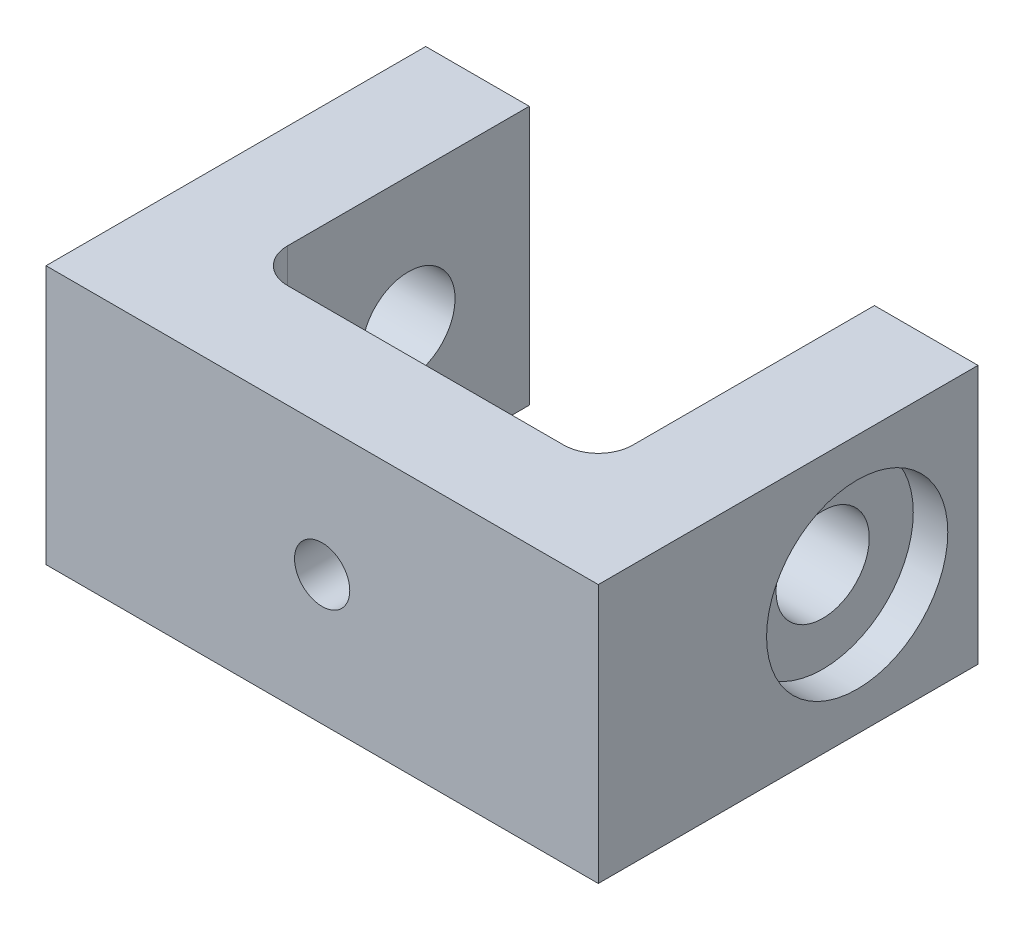
ISO-10303-21;
HEADER;
FILE_DESCRIPTION(('STEP AP214'),'2;1');
FILE_NAME('part.step','',(''),(''),'','','');
FILE_SCHEMA(('AUTOMOTIVE_DESIGN { 1 0 10303 214 1 1 1 1 }'));
ENDSEC;
DATA;
#1=APPLICATION_CONTEXT('core data for automotive mechanical design processes');
#2=APPLICATION_PROTOCOL_DEFINITION('international standard','automotive_design',2000,#1);
#3=PRODUCT_CONTEXT('',#1,'mechanical');
#4=PRODUCT('Part','Part','',(#3));
#5=PRODUCT_RELATED_PRODUCT_CATEGORY('part','',(#4));
#6=PRODUCT_DEFINITION_FORMATION('','',#4);
#7=PRODUCT_DEFINITION_CONTEXT('part definition',#1,'design');
#8=PRODUCT_DEFINITION('design','',#6,#7);
#9=PRODUCT_DEFINITION_SHAPE('','',#8);
#10=(LENGTH_UNIT() NAMED_UNIT(*) SI_UNIT(.MILLI.,.METRE.));
#11=(NAMED_UNIT(*) PLANE_ANGLE_UNIT() SI_UNIT($,.RADIAN.));
#12=(NAMED_UNIT(*) SI_UNIT($,.STERADIAN.) SOLID_ANGLE_UNIT());
#13=UNCERTAINTY_MEASURE_WITH_UNIT(LENGTH_MEASURE(1.E-05),#10,'distance_accuracy_value','');
#14=(GEOMETRIC_REPRESENTATION_CONTEXT(3) GLOBAL_UNCERTAINTY_ASSIGNED_CONTEXT((#13)) GLOBAL_UNIT_ASSIGNED_CONTEXT((#10,
#11,#12)) REPRESENTATION_CONTEXT('',''));
#15=CARTESIAN_POINT('',(0.,0.,0.));
#16=DIRECTION('',(0.,0.,1.));
#17=DIRECTION('',(1.,0.,0.));
#18=AXIS2_PLACEMENT_3D('',#15,#16,#17);
#19=CARTESIAN_POINT('',(0.,-7.5,0.));
#20=DIRECTION('',(0.,1.,0.));
#21=DIRECTION('',(1.,0.,0.));
#22=AXIS2_PLACEMENT_3D('',#19,#20,#21);
#23=PLANE('',#22);
#24=CARTESIAN_POINT('',(8.,-7.5,-8.));
#25=DIRECTION('',(0.,1.,0.));
#26=DIRECTION('',(0.,0.,1.));
#27=AXIS2_PLACEMENT_3D('',#24,#25,#26);
#28=CIRCLE('',#27,2.);
#29=CARTESIAN_POINT('',(8.,-7.5,-6.));
#30=VERTEX_POINT('',#29);
#31=CARTESIAN_POINT('',(10.,-7.5,-8.));
#32=VERTEX_POINT('',#31);
#33=EDGE_CURVE('E11',#30,#32,#28,.T.);
#34=ORIENTED_EDGE('',*,*,#33,.T.);
#35=DIRECTION('',(0.,0.,1.));
#36=VECTOR('',#35,1.);
#37=CARTESIAN_POINT('',(10.,-7.5,-22.));
#38=LINE('',#37,#36);
#39=CARTESIAN_POINT('',(10.,-7.5,-22.));
#40=VERTEX_POINT('',#39);
#41=EDGE_CURVE('E36',#40,#32,#38,.T.);
#42=ORIENTED_EDGE('',*,*,#41,.F.);
#43=DIRECTION('',(-1.,0.,0.));
#44=VECTOR('',#43,1.);
#45=CARTESIAN_POINT('',(16.,-7.5,-22.));
#46=LINE('',#45,#44);
#47=CARTESIAN_POINT('',(16.,-7.5,-22.));
#48=VERTEX_POINT('',#47);
#49=EDGE_CURVE('E136',#48,#40,#46,.T.);
#50=ORIENTED_EDGE('',*,*,#49,.F.);
#51=DIRECTION('',(0.,0.,-1.));
#52=VECTOR('',#51,1.);
#53=CARTESIAN_POINT('',(16.,-7.5,0.));
#54=LINE('',#53,#52);
#55=CARTESIAN_POINT('',(16.,-7.5,0.));
#56=VERTEX_POINT('',#55);
#57=EDGE_CURVE('E114',#56,#48,#54,.T.);
#58=ORIENTED_EDGE('',*,*,#57,.F.);
#59=DIRECTION('',(1.,0.,0.));
#60=VECTOR('',#59,1.);
#61=CARTESIAN_POINT('',(-16.,-7.5,0.));
#62=LINE('',#61,#60);
#63=CARTESIAN_POINT('',(-16.,-7.5,0.));
#64=VERTEX_POINT('',#63);
#65=EDGE_CURVE('E112',#64,#56,#62,.T.);
#66=ORIENTED_EDGE('',*,*,#65,.F.);
#67=DIRECTION('',(0.,0.,1.));
#68=VECTOR('',#67,1.);
#69=CARTESIAN_POINT('',(-16.,-7.5,-22.));
#70=LINE('',#69,#68);
#71=CARTESIAN_POINT('',(-16.,-7.5,-22.));
#72=VERTEX_POINT('',#71);
#73=EDGE_CURVE('E398',#72,#64,#70,.T.);
#74=ORIENTED_EDGE('',*,*,#73,.F.);
#75=DIRECTION('',(-1.,0.,0.));
#76=VECTOR('',#75,1.);
#77=CARTESIAN_POINT('',(-10.,-7.5,-22.));
#78=LINE('',#77,#76);
#79=CARTESIAN_POINT('',(-10.,-7.5,-22.));
#80=VERTEX_POINT('',#79);
#81=EDGE_CURVE('E403',#80,#72,#78,.T.);
#82=ORIENTED_EDGE('',*,*,#81,.F.);
#83=DIRECTION('',(0.,0.,-1.));
#84=VECTOR('',#83,1.);
#85=CARTESIAN_POINT('',(-10.,-7.5,-8.));
#86=LINE('',#85,#84);
#87=CARTESIAN_POINT('',(-10.,-7.5,-8.));
#88=VERTEX_POINT('',#87);
#89=EDGE_CURVE('E408',#88,#80,#86,.T.);
#90=ORIENTED_EDGE('',*,*,#89,.F.);
#91=CARTESIAN_POINT('',(-8.,-7.5,-8.));
#92=DIRECTION('',(0.,1.,0.));
#93=DIRECTION('',(-1.,0.,0.));
#94=AXIS2_PLACEMENT_3D('',#91,#92,#93);
#95=CIRCLE('',#94,2.);
#96=CARTESIAN_POINT('',(-8.,-7.5,-6.));
#97=VERTEX_POINT('',#96);
#98=EDGE_CURVE('E27',#88,#97,#95,.T.);
#99=ORIENTED_EDGE('',*,*,#98,.T.);
#100=DIRECTION('',(-1.,0.,0.));
#101=VECTOR('',#100,1.);
#102=CARTESIAN_POINT('',(8.,-7.5,-6.));
#103=LINE('',#102,#101);
#104=EDGE_CURVE('E429',#30,#97,#103,.T.);
#105=ORIENTED_EDGE('',*,*,#104,.F.);
#106=EDGE_LOOP('',(#34,#42,#50,#58,#66,#74,#82,#90,#99,#105));
#107=FACE_BOUND('',#106,.T.);
#108=ADVANCED_FACE('F17',(#107),#23,.F.);
#109=CARTESIAN_POINT('',(10.,-7.5,-6.));
#110=DIRECTION('',(0.,0.,-1.));
#111=DIRECTION('',(-1.,0.,0.));
#112=AXIS2_PLACEMENT_3D('',#109,#110,#111);
#113=PLANE('',#112);
#114=ORIENTED_EDGE('',*,*,#104,.T.);
#115=DIRECTION('',(0.,1.,0.));
#116=VECTOR('',#115,1.);
#117=CARTESIAN_POINT('',(-8.,-7.5,-6.));
#118=LINE('',#117,#116);
#119=CARTESIAN_POINT('',(-8.,7.5,-6.));
#120=VERTEX_POINT('',#119);
#121=EDGE_CURVE('E431',#97,#120,#118,.T.);
#122=ORIENTED_EDGE('',*,*,#121,.T.);
#123=DIRECTION('',(-1.,0.,0.));
#124=VECTOR('',#123,1.);
#125=CARTESIAN_POINT('',(8.,7.5,-6.));
#126=LINE('',#125,#124);
#127=CARTESIAN_POINT('',(8.,7.5,-6.));
#128=VERTEX_POINT('',#127);
#129=EDGE_CURVE('E132',#128,#120,#126,.T.);
#130=ORIENTED_EDGE('',*,*,#129,.F.);
#131=DIRECTION('',(0.,1.,0.));
#132=VECTOR('',#131,1.);
#133=CARTESIAN_POINT('',(8.,-7.5,-6.));
#134=LINE('',#133,#132);
#135=EDGE_CURVE('E436',#30,#128,#134,.T.);
#136=ORIENTED_EDGE('',*,*,#135,.F.);
#137=EDGE_LOOP('',(#114,#122,#130,#136));
#138=FACE_BOUND('',#137,.T.);
#139=CARTESIAN_POINT('',(0.,0.,-6.));
#140=DIRECTION('',(0.,0.,1.));
#141=DIRECTION('',(1.,0.,0.));
#142=AXIS2_PLACEMENT_3D('',#139,#140,#141);
#143=CIRCLE('',#142,5.75);
#144=CARTESIAN_POINT('',(5.75,0.,-6.));
#145=VERTEX_POINT('',#144);
#146=EDGE_CURVE('E434',#145,#145,#143,.T.);
#147=ORIENTED_EDGE('',*,*,#146,.T.);
#148=EDGE_LOOP('',(#147));
#149=FACE_BOUND('',#148,.T.);
#150=ADVANCED_FACE('F158',(#138,#149),#113,.T.);
#151=CARTESIAN_POINT('',(8.,-27.054,-8.));
#152=DIRECTION('',(0.,1.,0.));
#153=DIRECTION('',(0.,0.,1.));
#154=AXIS2_PLACEMENT_3D('',#151,#152,#153);
#155=CYLINDRICAL_SURFACE('',#154,2.);
#156=CARTESIAN_POINT('',(8.,7.5,-8.));
#157=DIRECTION('',(0.,-1.,0.));
#158=DIRECTION('',(1.,0.,0.));
#159=AXIS2_PLACEMENT_3D('',#156,#157,#158);
#160=CIRCLE('',#159,2.);
#161=CARTESIAN_POINT('',(10.,7.5,-8.));
#162=VERTEX_POINT('',#161);
#163=EDGE_CURVE('E374',#162,#128,#160,.T.);
#164=ORIENTED_EDGE('',*,*,#163,.F.);
#165=DIRECTION('',(0.,1.,0.));
#166=VECTOR('',#165,1.);
#167=CARTESIAN_POINT('',(10.,-7.5,-8.));
#168=LINE('',#167,#166);
#169=EDGE_CURVE('E372',#32,#162,#168,.T.);
#170=ORIENTED_EDGE('',*,*,#169,.F.);
#171=ORIENTED_EDGE('',*,*,#33,.F.);
#172=ORIENTED_EDGE('',*,*,#135,.T.);
#173=EDGE_LOOP('',(#164,#170,#171,#172));
#174=FACE_BOUND('',#173,.T.);
#175=ADVANCED_FACE('F164',(#174),#155,.F.);
#176=CARTESIAN_POINT('',(10.,-7.5,-22.));
#177=DIRECTION('',(-1.,0.,0.));
#178=DIRECTION('',(0.,0.,1.));
#179=AXIS2_PLACEMENT_3D('',#176,#177,#178);
#180=PLANE('',#179);
#181=DIRECTION('',(0.,0.,1.));
#182=VECTOR('',#181,1.);
#183=CARTESIAN_POINT('',(10.,7.5,-22.));
#184=LINE('',#183,#182);
#185=CARTESIAN_POINT('',(10.,7.5,-22.));
#186=VERTEX_POINT('',#185);
#187=EDGE_CURVE('E128',#186,#162,#184,.T.);
#188=ORIENTED_EDGE('',*,*,#187,.F.);
#189=DIRECTION('',(0.,1.,0.));
#190=VECTOR('',#189,1.);
#191=CARTESIAN_POINT('',(10.,-7.5,-22.));
#192=LINE('',#191,#190);
#193=EDGE_CURVE('E365',#40,#186,#192,.T.);
#194=ORIENTED_EDGE('',*,*,#193,.F.);
#195=ORIENTED_EDGE('',*,*,#41,.T.);
#196=ORIENTED_EDGE('',*,*,#169,.T.);
#197=EDGE_LOOP('',(#188,#194,#195,#196));
#198=FACE_BOUND('',#197,.T.);
#199=CARTESIAN_POINT('',(10.,0.,-15.));
#200=DIRECTION('',(1.,0.,0.));
#201=DIRECTION('',(0.,-1.,0.));
#202=AXIS2_PLACEMENT_3D('',#199,#200,#201);
#203=CIRCLE('',#202,2.7);
#204=CARTESIAN_POINT('',(10.,-2.7,-15.));
#205=VERTEX_POINT('',#204);
#206=EDGE_CURVE('E379',#205,#205,#203,.T.);
#207=ORIENTED_EDGE('',*,*,#206,.T.);
#208=EDGE_LOOP('',(#207));
#209=FACE_BOUND('',#208,.T.);
#210=ADVANCED_FACE('F170',(#198,#209),#180,.T.);
#211=CARTESIAN_POINT('',(-16.,0.,-15.));
#212=DIRECTION('',(1.,0.,0.));
#213=DIRECTION('',(0.,1.,0.));
#214=AXIS2_PLACEMENT_3D('',#211,#212,#213);
#215=CYLINDRICAL_SURFACE('',#214,2.7);
#216=CARTESIAN_POINT('',(-10.,0.,-15.));
#217=DIRECTION('',(1.,0.,0.));
#218=DIRECTION('',(0.,1.,0.));
#219=AXIS2_PLACEMENT_3D('',#216,#217,#218);
#220=CIRCLE('',#219,2.7);
#221=CARTESIAN_POINT('',(-10.,2.7,-15.));
#222=VERTEX_POINT('',#221);
#223=EDGE_CURVE('E382',#222,#222,#220,.T.);
#224=ORIENTED_EDGE('',*,*,#223,.T.);
#225=EDGE_LOOP('',(#224));
#226=FACE_BOUND('',#225,.T.);
#227=CARTESIAN_POINT('',(-14.,0.,-15.));
#228=DIRECTION('',(1.,0.,0.));
#229=DIRECTION('',(0.,1.,0.));
#230=AXIS2_PLACEMENT_3D('',#227,#228,#229);
#231=CIRCLE('',#230,2.7);
#232=CARTESIAN_POINT('',(-14.,2.7,-15.));
#233=VERTEX_POINT('',#232);
#234=EDGE_CURVE('E386',#233,#233,#231,.T.);
#235=ORIENTED_EDGE('',*,*,#234,.F.);
#236=EDGE_LOOP('',(#235));
#237=FACE_BOUND('',#236,.T.);
#238=ADVANCED_FACE('F174',(#226,#237),#215,.F.);
#239=CARTESIAN_POINT('',(-16.,0.,-15.));
#240=DIRECTION('',(1.,0.,0.));
#241=DIRECTION('',(0.,1.,0.));
#242=AXIS2_PLACEMENT_3D('',#239,#240,#241);
#243=CYLINDRICAL_SURFACE('',#242,2.7);
#244=CARTESIAN_POINT('',(14.,0.,-15.));
#245=DIRECTION('',(1.,0.,0.));
#246=DIRECTION('',(0.,1.,0.));
#247=AXIS2_PLACEMENT_3D('',#244,#245,#246);
#248=CIRCLE('',#247,2.7);
#249=CARTESIAN_POINT('',(14.,2.7,-15.));
#250=VERTEX_POINT('',#249);
#251=EDGE_CURVE('E385',#250,#250,#248,.T.);
#252=ORIENTED_EDGE('',*,*,#251,.T.);
#253=EDGE_LOOP('',(#252));
#254=FACE_BOUND('',#253,.T.);
#255=ORIENTED_EDGE('',*,*,#206,.F.);
#256=EDGE_LOOP('',(#255));
#257=FACE_BOUND('',#256,.T.);
#258=ADVANCED_FACE('F177',(#254,#257),#243,.F.);
#259=CARTESIAN_POINT('',(-14.,-7.5,0.));
#260=DIRECTION('',(-1.,0.,0.));
#261=DIRECTION('',(0.,1.,0.));
#262=AXIS2_PLACEMENT_3D('',#259,#260,#261);
#263=PLANE('',#262);
#264=CARTESIAN_POINT('',(-14.,0.,-15.));
#265=DIRECTION('',(-1.,0.,0.));
#266=DIRECTION('',(0.,-1.,0.));
#267=AXIS2_PLACEMENT_3D('',#264,#265,#266);
#268=CIRCLE('',#267,5.25);
#269=CARTESIAN_POINT('',(-14.,-5.25,-15.));
#270=VERTEX_POINT('',#269);
#271=EDGE_CURVE('E389',#270,#270,#268,.T.);
#272=ORIENTED_EDGE('',*,*,#271,.T.);
#273=EDGE_LOOP('',(#272));
#274=FACE_BOUND('',#273,.T.);
#275=ORIENTED_EDGE('',*,*,#234,.T.);
#276=EDGE_LOOP('',(#275));
#277=FACE_BOUND('',#276,.T.);
#278=ADVANCED_FACE('F181',(#274,#277),#263,.T.);
#279=CARTESIAN_POINT('',(-16.,0.,-15.));
#280=DIRECTION('',(-1.,0.,0.));
#281=DIRECTION('',(0.,1.,0.));
#282=AXIS2_PLACEMENT_3D('',#279,#280,#281);
#283=CYLINDRICAL_SURFACE('',#282,5.25);
#284=ORIENTED_EDGE('',*,*,#271,.F.);
#285=EDGE_LOOP('',(#284));
#286=FACE_BOUND('',#285,.T.);
#287=CARTESIAN_POINT('',(-16.,0.,-15.));
#288=DIRECTION('',(-1.,0.,0.));
#289=DIRECTION('',(0.,1.,0.));
#290=AXIS2_PLACEMENT_3D('',#287,#288,#289);
#291=CIRCLE('',#290,5.25);
#292=CARTESIAN_POINT('',(-16.,5.25,-15.));
#293=VERTEX_POINT('',#292);
#294=EDGE_CURVE('E390',#293,#293,#291,.T.);
#295=ORIENTED_EDGE('',*,*,#294,.T.);
#296=EDGE_LOOP('',(#295));
#297=FACE_BOUND('',#296,.T.);
#298=ADVANCED_FACE('F185',(#286,#297),#283,.F.);
#299=CARTESIAN_POINT('',(-16.,-7.5,-22.));
#300=DIRECTION('',(-1.,0.,0.));
#301=DIRECTION('',(0.,0.,1.));
#302=AXIS2_PLACEMENT_3D('',#299,#300,#301);
#303=PLANE('',#302);
#304=DIRECTION('',(0.,1.,0.));
#305=VECTOR('',#304,1.);
#306=CARTESIAN_POINT('',(-16.,-7.5,0.));
#307=LINE('',#306,#305);
#308=CARTESIAN_POINT('',(-16.,7.5,0.));
#309=VERTEX_POINT('',#308);
#310=EDGE_CURVE('E397',#64,#309,#307,.T.);
#311=ORIENTED_EDGE('',*,*,#310,.T.);
#312=DIRECTION('',(0.,0.,1.));
#313=VECTOR('',#312,1.);
#314=CARTESIAN_POINT('',(-16.,7.5,-22.));
#315=LINE('',#314,#313);
#316=CARTESIAN_POINT('',(-16.,7.5,-22.));
#317=VERTEX_POINT('',#316);
#318=EDGE_CURVE('E118',#317,#309,#315,.T.);
#319=ORIENTED_EDGE('',*,*,#318,.F.);
#320=DIRECTION('',(0.,1.,0.));
#321=VECTOR('',#320,1.);
#322=CARTESIAN_POINT('',(-16.,-7.5,-22.));
#323=LINE('',#322,#321);
#324=EDGE_CURVE('E400',#72,#317,#323,.T.);
#325=ORIENTED_EDGE('',*,*,#324,.F.);
#326=ORIENTED_EDGE('',*,*,#73,.T.);
#327=EDGE_LOOP('',(#311,#319,#325,#326));
#328=FACE_BOUND('',#327,.T.);
#329=ORIENTED_EDGE('',*,*,#294,.F.);
#330=EDGE_LOOP('',(#329));
#331=FACE_BOUND('',#330,.T.);
#332=ADVANCED_FACE('F189',(#328,#331),#303,.T.);
#333=CARTESIAN_POINT('',(-10.,-7.5,-22.));
#334=DIRECTION('',(0.,0.,-1.));
#335=DIRECTION('',(-1.,0.,0.));
#336=AXIS2_PLACEMENT_3D('',#333,#334,#335);
#337=PLANE('',#336);
#338=ORIENTED_EDGE('',*,*,#324,.T.);
#339=DIRECTION('',(-1.,0.,0.));
#340=VECTOR('',#339,1.);
#341=CARTESIAN_POINT('',(-10.,7.5,-22.));
#342=LINE('',#341,#340);
#343=CARTESIAN_POINT('',(-10.,7.5,-22.));
#344=VERTEX_POINT('',#343);
#345=EDGE_CURVE('E121',#344,#317,#342,.T.);
#346=ORIENTED_EDGE('',*,*,#345,.F.);
#347=DIRECTION('',(0.,1.,0.));
#348=VECTOR('',#347,1.);
#349=CARTESIAN_POINT('',(-10.,-7.5,-22.));
#350=LINE('',#349,#348);
#351=EDGE_CURVE('E405',#80,#344,#350,.T.);
#352=ORIENTED_EDGE('',*,*,#351,.F.);
#353=ORIENTED_EDGE('',*,*,#81,.T.);
#354=EDGE_LOOP('',(#338,#346,#352,#353));
#355=FACE_BOUND('',#354,.T.);
#356=ADVANCED_FACE('F193',(#355),#337,.T.);
#357=CARTESIAN_POINT('',(-10.,-7.5,-6.));
#358=DIRECTION('',(1.,0.,0.));
#359=DIRECTION('',(0.,0.,-1.));
#360=AXIS2_PLACEMENT_3D('',#357,#358,#359);
#361=PLANE('',#360);
#362=ORIENTED_EDGE('',*,*,#89,.T.);
#363=ORIENTED_EDGE('',*,*,#351,.T.);
#364=DIRECTION('',(0.,0.,-1.));
#365=VECTOR('',#364,1.);
#366=CARTESIAN_POINT('',(-10.,7.5,-8.));
#367=LINE('',#366,#365);
#368=CARTESIAN_POINT('',(-10.,7.5,-8.));
#369=VERTEX_POINT('',#368);
#370=EDGE_CURVE('E133',#369,#344,#367,.T.);
#371=ORIENTED_EDGE('',*,*,#370,.F.);
#372=DIRECTION('',(0.,1.,0.));
#373=VECTOR('',#372,1.);
#374=CARTESIAN_POINT('',(-10.,-7.5,-8.));
#375=LINE('',#374,#373);
#376=EDGE_CURVE('E367',#88,#369,#375,.T.);
#377=ORIENTED_EDGE('',*,*,#376,.F.);
#378=EDGE_LOOP('',(#362,#363,#371,#377));
#379=FACE_BOUND('',#378,.T.);
#380=ORIENTED_EDGE('',*,*,#223,.F.);
#381=EDGE_LOOP('',(#380));
#382=FACE_BOUND('',#381,.T.);
#383=ADVANCED_FACE('F197',(#379,#382),#361,.T.);
#384=CARTESIAN_POINT('',(14.,-7.5,0.));
#385=DIRECTION('',(1.,0.,0.));
#386=DIRECTION('',(0.,-1.,0.));
#387=AXIS2_PLACEMENT_3D('',#384,#385,#386);
#388=PLANE('',#387);
#389=CARTESIAN_POINT('',(14.,0.,-15.));
#390=DIRECTION('',(1.,0.,0.));
#391=DIRECTION('',(0.,1.,0.));
#392=AXIS2_PLACEMENT_3D('',#389,#390,#391);
#393=CIRCLE('',#392,5.25);
#394=CARTESIAN_POINT('',(14.,5.25,-15.));
#395=VERTEX_POINT('',#394);
#396=EDGE_CURVE('E409',#395,#395,#393,.T.);
#397=ORIENTED_EDGE('',*,*,#396,.T.);
#398=EDGE_LOOP('',(#397));
#399=FACE_BOUND('',#398,.T.);
#400=ORIENTED_EDGE('',*,*,#251,.F.);
#401=EDGE_LOOP('',(#400));
#402=FACE_BOUND('',#401,.T.);
#403=ADVANCED_FACE('F201',(#399,#402),#388,.T.);
#404=CARTESIAN_POINT('',(16.,0.,-15.));
#405=DIRECTION('',(1.,0.,0.));
#406=DIRECTION('',(0.,-1.,0.));
#407=AXIS2_PLACEMENT_3D('',#404,#405,#406);
#408=CYLINDRICAL_SURFACE('',#407,5.25);
#409=ORIENTED_EDGE('',*,*,#396,.F.);
#410=EDGE_LOOP('',(#409));
#411=FACE_BOUND('',#410,.T.);
#412=CARTESIAN_POINT('',(16.,0.,-15.));
#413=DIRECTION('',(1.,0.,0.));
#414=DIRECTION('',(0.,-1.,0.));
#415=AXIS2_PLACEMENT_3D('',#412,#413,#414);
#416=CIRCLE('',#415,5.25);
#417=CARTESIAN_POINT('',(16.,-5.25,-15.));
#418=VERTEX_POINT('',#417);
#419=EDGE_CURVE('E415',#418,#418,#416,.T.);
#420=ORIENTED_EDGE('',*,*,#419,.T.);
#421=EDGE_LOOP('',(#420));
#422=FACE_BOUND('',#421,.T.);
#423=ADVANCED_FACE('F205',(#411,#422),#408,.F.);
#424=CARTESIAN_POINT('',(16.,-7.5,0.));
#425=DIRECTION('',(1.,0.,0.));
#426=DIRECTION('',(0.,0.,-1.));
#427=AXIS2_PLACEMENT_3D('',#424,#425,#426);
#428=PLANE('',#427);
#429=DIRECTION('',(0.,1.,0.));
#430=VECTOR('',#429,1.);
#431=CARTESIAN_POINT('',(16.,-7.5,-22.));
#432=LINE('',#431,#430);
#433=CARTESIAN_POINT('',(16.,7.5,-22.));
#434=VERTEX_POINT('',#433);
#435=EDGE_CURVE('E102',#48,#434,#432,.T.);
#436=ORIENTED_EDGE('',*,*,#435,.T.);
#437=DIRECTION('',(0.,0.,-1.));
#438=VECTOR('',#437,1.);
#439=CARTESIAN_POINT('',(16.,7.5,0.));
#440=LINE('',#439,#438);
#441=CARTESIAN_POINT('',(16.,7.5,0.));
#442=VERTEX_POINT('',#441);
#443=EDGE_CURVE('E92',#442,#434,#440,.T.);
#444=ORIENTED_EDGE('',*,*,#443,.F.);
#445=DIRECTION('',(0.,1.,0.));
#446=VECTOR('',#445,1.);
#447=CARTESIAN_POINT('',(16.,-7.5,0.));
#448=LINE('',#447,#446);
#449=EDGE_CURVE('E100',#56,#442,#448,.T.);
#450=ORIENTED_EDGE('',*,*,#449,.F.);
#451=ORIENTED_EDGE('',*,*,#57,.T.);
#452=EDGE_LOOP('',(#436,#444,#450,#451));
#453=FACE_BOUND('',#452,.T.);
#454=ORIENTED_EDGE('',*,*,#419,.F.);
#455=EDGE_LOOP('',(#454));
#456=FACE_BOUND('',#455,.T.);
#457=ADVANCED_FACE('F97',(#453,#456),#428,.T.);
#458=CARTESIAN_POINT('',(-16.,-7.5,0.));
#459=DIRECTION('',(0.,0.,1.));
#460=DIRECTION('',(1.,0.,0.));
#461=AXIS2_PLACEMENT_3D('',#458,#459,#460);
#462=PLANE('',#461);
#463=ORIENTED_EDGE('',*,*,#449,.T.);
#464=DIRECTION('',(1.,0.,0.));
#465=VECTOR('',#464,1.);
#466=CARTESIAN_POINT('',(-16.,7.5,0.));
#467=LINE('',#466,#465);
#468=EDGE_CURVE('E104',#309,#442,#467,.T.);
#469=ORIENTED_EDGE('',*,*,#468,.F.);
#470=ORIENTED_EDGE('',*,*,#310,.F.);
#471=ORIENTED_EDGE('',*,*,#65,.T.);
#472=EDGE_LOOP('',(#463,#469,#470,#471));
#473=FACE_BOUND('',#472,.T.);
#474=CARTESIAN_POINT('',(0.,0.,0.));
#475=DIRECTION('',(0.,0.,-1.));
#476=DIRECTION('',(1.,0.,0.));
#477=AXIS2_PLACEMENT_3D('',#474,#475,#476);
#478=CIRCLE('',#477,1.6);
#479=CARTESIAN_POINT('',(1.6,0.,0.));
#480=VERTEX_POINT('',#479);
#481=EDGE_CURVE('E124',#480,#480,#478,.T.);
#482=ORIENTED_EDGE('',*,*,#481,.T.);
#483=EDGE_LOOP('',(#482));
#484=FACE_BOUND('',#483,.T.);
#485=ADVANCED_FACE('F109',(#473,#484),#462,.T.);
#486=CARTESIAN_POINT('',(0.,7.5,0.));
#487=DIRECTION('',(0.,1.,0.));
#488=DIRECTION('',(1.,0.,0.));
#489=AXIS2_PLACEMENT_3D('',#486,#487,#488);
#490=PLANE('',#489);
#491=ORIENTED_EDGE('',*,*,#345,.T.);
#492=ORIENTED_EDGE('',*,*,#318,.T.);
#493=ORIENTED_EDGE('',*,*,#468,.T.);
#494=ORIENTED_EDGE('',*,*,#443,.T.);
#495=DIRECTION('',(-1.,0.,0.));
#496=VECTOR('',#495,1.);
#497=CARTESIAN_POINT('',(16.,7.5,-22.));
#498=LINE('',#497,#496);
#499=EDGE_CURVE('E105',#434,#186,#498,.T.);
#500=ORIENTED_EDGE('',*,*,#499,.T.);
#501=ORIENTED_EDGE('',*,*,#187,.T.);
#502=ORIENTED_EDGE('',*,*,#163,.T.);
#503=ORIENTED_EDGE('',*,*,#129,.T.);
#504=CARTESIAN_POINT('',(-8.,7.5,-8.));
#505=DIRECTION('',(0.,-1.,0.));
#506=DIRECTION('',(0.,0.,1.));
#507=AXIS2_PLACEMENT_3D('',#504,#505,#506);
#508=CIRCLE('',#507,2.);
#509=EDGE_CURVE('E129',#120,#369,#508,.T.);
#510=ORIENTED_EDGE('',*,*,#509,.T.);
#511=ORIENTED_EDGE('',*,*,#370,.T.);
#512=EDGE_LOOP('',(#491,#492,#493,#494,#500,#501,#502,#503,#510,#511));
#513=FACE_BOUND('',#512,.T.);
#514=ADVANCED_FACE('F117',(#513),#490,.T.);
#515=CARTESIAN_POINT('',(-8.,-27.054,-8.));
#516=DIRECTION('',(0.,1.,0.));
#517=DIRECTION('',(-1.,0.,0.));
#518=AXIS2_PLACEMENT_3D('',#515,#516,#517);
#519=CYLINDRICAL_SURFACE('',#518,2.);
#520=ORIENTED_EDGE('',*,*,#509,.F.);
#521=ORIENTED_EDGE('',*,*,#121,.F.);
#522=ORIENTED_EDGE('',*,*,#98,.F.);
#523=ORIENTED_EDGE('',*,*,#376,.T.);
#524=EDGE_LOOP('',(#520,#521,#522,#523));
#525=FACE_BOUND('',#524,.T.);
#526=ADVANCED_FACE('F216',(#525),#519,.F.);
#527=CARTESIAN_POINT('',(16.,-7.5,-22.));
#528=DIRECTION('',(0.,0.,-1.));
#529=DIRECTION('',(-1.,0.,0.));
#530=AXIS2_PLACEMENT_3D('',#527,#528,#529);
#531=PLANE('',#530);
#532=ORIENTED_EDGE('',*,*,#193,.T.);
#533=ORIENTED_EDGE('',*,*,#499,.F.);
#534=ORIENTED_EDGE('',*,*,#435,.F.);
#535=ORIENTED_EDGE('',*,*,#49,.T.);
#536=EDGE_LOOP('',(#532,#533,#534,#535));
#537=FACE_BOUND('',#536,.T.);
#538=ADVANCED_FACE('F219',(#537),#531,.T.);
#539=CARTESIAN_POINT('',(0.,0.,0.));
#540=DIRECTION('',(0.,0.,-1.));
#541=DIRECTION('',(-1.,0.,0.));
#542=AXIS2_PLACEMENT_3D('',#539,#540,#541);
#543=CYLINDRICAL_SURFACE('',#542,1.6);
#544=CARTESIAN_POINT('',(0.,0.,-4.));
#545=DIRECTION('',(0.,0.,-1.));
#546=DIRECTION('',(-1.,0.,0.));
#547=AXIS2_PLACEMENT_3D('',#544,#545,#546);
#548=CIRCLE('',#547,1.6);
#549=CARTESIAN_POINT('',(-1.6,0.,-4.));
#550=VERTEX_POINT('',#549);
#551=EDGE_CURVE('E134',#550,#550,#548,.T.);
#552=ORIENTED_EDGE('',*,*,#551,.T.);
#553=EDGE_LOOP('',(#552));
#554=FACE_BOUND('',#553,.T.);
#555=ORIENTED_EDGE('',*,*,#481,.F.);
#556=EDGE_LOOP('',(#555));
#557=FACE_BOUND('',#556,.T.);
#558=ADVANCED_FACE('F154',(#554,#557),#543,.F.);
#559=CARTESIAN_POINT('',(0.,0.,-4.));
#560=DIRECTION('',(0.,0.,1.));
#561=DIRECTION('',(1.,0.,0.));
#562=AXIS2_PLACEMENT_3D('',#559,#560,#561);
#563=PLANE('',#562);
#564=CARTESIAN_POINT('',(0.,0.,-4.));
#565=DIRECTION('',(0.,0.,1.));
#566=DIRECTION('',(-1.,0.,0.));
#567=AXIS2_PLACEMENT_3D('',#564,#565,#566);
#568=CIRCLE('',#567,4.75);
#569=CARTESIAN_POINT('',(-4.75,0.,-4.));
#570=VERTEX_POINT('',#569);
#571=EDGE_CURVE('E137',#570,#570,#568,.T.);
#572=ORIENTED_EDGE('',*,*,#571,.F.);
#573=EDGE_LOOP('',(#572));
#574=FACE_BOUND('',#573,.T.);
#575=ORIENTED_EDGE('',*,*,#551,.F.);
#576=EDGE_LOOP('',(#575));
#577=FACE_BOUND('',#576,.T.);
#578=ADVANCED_FACE('F148',(#574,#577),#563,.F.);
#579=CARTESIAN_POINT('',(0.,0.,-6.));
#580=DIRECTION('',(0.,0.,1.));
#581=DIRECTION('',(1.,0.,0.));
#582=AXIS2_PLACEMENT_3D('',#579,#580,#581);
#583=CYLINDRICAL_SURFACE('',#582,4.75);
#584=ORIENTED_EDGE('',*,*,#571,.T.);
#585=EDGE_LOOP('',(#584));
#586=FACE_BOUND('',#585,.T.);
#587=CARTESIAN_POINT('',(0.,0.,-5.));
#588=DIRECTION('',(0.,0.,1.));
#589=DIRECTION('',(1.,0.,0.));
#590=AXIS2_PLACEMENT_3D('',#587,#588,#589);
#591=CIRCLE('',#590,4.75);
#592=CARTESIAN_POINT('',(4.75,0.,-5.));
#593=VERTEX_POINT('',#592);
#594=EDGE_CURVE('E21',#593,#593,#591,.T.);
#595=ORIENTED_EDGE('',*,*,#594,.F.);
#596=EDGE_LOOP('',(#595));
#597=FACE_BOUND('',#596,.T.);
#598=ADVANCED_FACE('F146',(#586,#597),#583,.F.);
#599=CARTESIAN_POINT('',(0.,0.,-5.));
#600=DIRECTION('',(0.,0.,1.));
#601=DIRECTION('',(0.999909202903121,-0.0134753830982503,0.));
#602=AXIS2_PLACEMENT_3D('',#599,#600,#601);
#603=TOROIDAL_SURFACE('',#602,5.75,1.);
#604=ORIENTED_EDGE('',*,*,#594,.T.);
#605=EDGE_LOOP('',(#604));
#606=FACE_BOUND('',#605,.T.);
#607=ORIENTED_EDGE('',*,*,#146,.F.);
#608=EDGE_LOOP('',(#607));
#609=FACE_BOUND('',#608,.T.);
#610=ADVANCED_FACE('F19',(#606,#609),#603,.T.);
#611=CLOSED_SHELL('',(#108,#150,#175,#210,#238,#258,#278,#298,#332,#356,#383,#403,#423,#457,
#485,#514,#526,#538,#558,#578,#598,#610));
#612=MANIFOLD_SOLID_BREP('B1',#611);
#613=ADVANCED_BREP_SHAPE_REPRESENTATION('',(#18,#612),#14);
#614=SHAPE_DEFINITION_REPRESENTATION(#9,#613);
ENDSEC;
END-ISO-10303-21;
